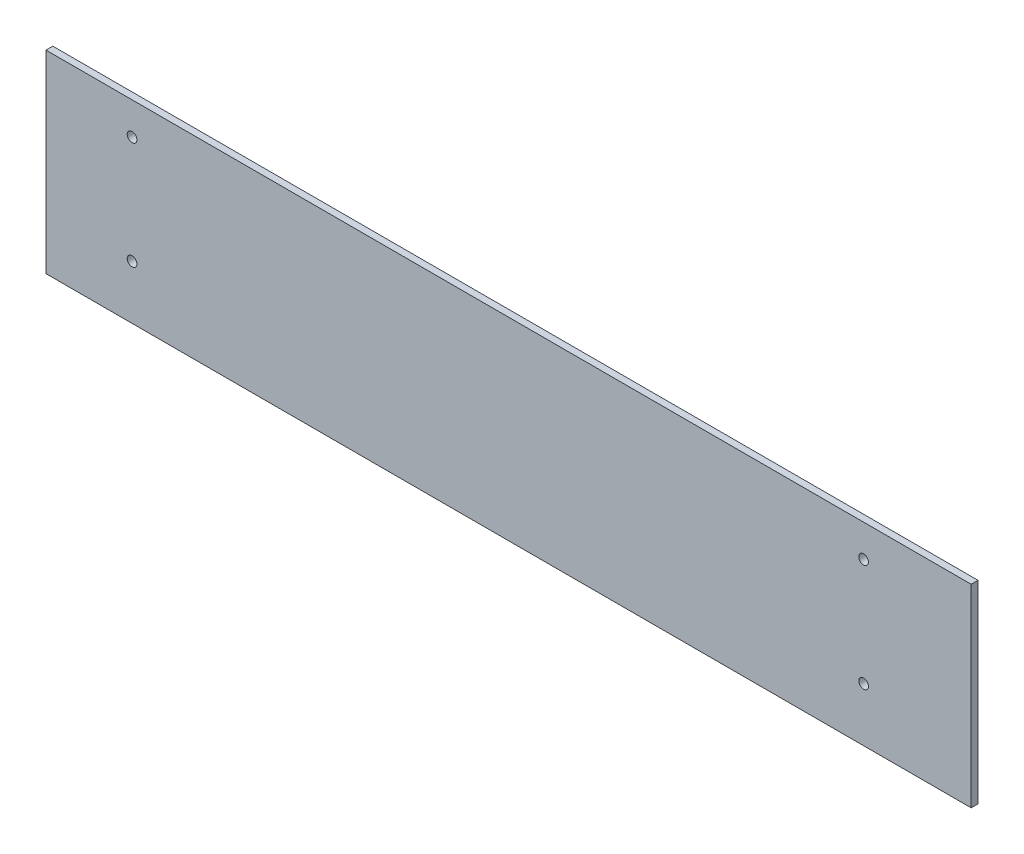
ISO-10303-21;
HEADER;
FILE_DESCRIPTION(('STEP AP214'),'2;1');
FILE_NAME('part.step','',(''),(''),'','','');
FILE_SCHEMA(('AUTOMOTIVE_DESIGN { 1 0 10303 214 1 1 1 1 }'));
ENDSEC;
DATA;
#1=APPLICATION_CONTEXT('core data for automotive mechanical design processes');
#2=APPLICATION_PROTOCOL_DEFINITION('international standard','automotive_design',2000,#1);
#3=PRODUCT_CONTEXT('',#1,'mechanical');
#4=PRODUCT('Part','Part','',(#3));
#5=PRODUCT_RELATED_PRODUCT_CATEGORY('part','',(#4));
#6=PRODUCT_DEFINITION_FORMATION('','',#4);
#7=PRODUCT_DEFINITION_CONTEXT('part definition',#1,'design');
#8=PRODUCT_DEFINITION('design','',#6,#7);
#9=PRODUCT_DEFINITION_SHAPE('','',#8);
#10=(LENGTH_UNIT() NAMED_UNIT(*) SI_UNIT(.MILLI.,.METRE.));
#11=(NAMED_UNIT(*) PLANE_ANGLE_UNIT() SI_UNIT($,.RADIAN.));
#12=(NAMED_UNIT(*) SI_UNIT($,.STERADIAN.) SOLID_ANGLE_UNIT());
#13=UNCERTAINTY_MEASURE_WITH_UNIT(LENGTH_MEASURE(1.E-05),#10,'distance_accuracy_value','');
#14=(GEOMETRIC_REPRESENTATION_CONTEXT(3) GLOBAL_UNCERTAINTY_ASSIGNED_CONTEXT((#13)) GLOBAL_UNIT_ASSIGNED_CONTEXT((#10,
#11,#12)) REPRESENTATION_CONTEXT('',''));
#15=CARTESIAN_POINT('',(0.,0.,0.));
#16=DIRECTION('',(0.,0.,1.));
#17=DIRECTION('',(1.,0.,0.));
#18=AXIS2_PLACEMENT_3D('',#15,#16,#17);
#19=CARTESIAN_POINT('',(215.,-45.,3.175));
#20=DIRECTION('',(-1.,0.,0.));
#21=DIRECTION('',(0.,0.,1.));
#22=AXIS2_PLACEMENT_3D('',#19,#20,#21);
#23=PLANE('',#22);
#24=DIRECTION('',(0.,1.,0.));
#25=VECTOR('',#24,1.);
#26=CARTESIAN_POINT('',(215.,-45.,0.));
#27=LINE('',#26,#25);
#28=CARTESIAN_POINT('',(215.,-45.,0.));
#29=VERTEX_POINT('',#28);
#30=CARTESIAN_POINT('',(215.,45.,0.));
#31=VERTEX_POINT('',#30);
#32=EDGE_CURVE('E111',#29,#31,#27,.T.);
#33=ORIENTED_EDGE('',*,*,#32,.T.);
#34=DIRECTION('',(0.,0.,-1.));
#35=VECTOR('',#34,1.);
#36=CARTESIAN_POINT('',(215.,45.,3.175));
#37=LINE('',#36,#35);
#38=CARTESIAN_POINT('',(215.,45.,3.175));
#39=VERTEX_POINT('',#38);
#40=EDGE_CURVE('E11',#39,#31,#37,.T.);
#41=ORIENTED_EDGE('',*,*,#40,.F.);
#42=DIRECTION('',(0.,1.,0.));
#43=VECTOR('',#42,1.);
#44=CARTESIAN_POINT('',(215.,-45.,3.175));
#45=LINE('',#44,#43);
#46=CARTESIAN_POINT('',(215.,-45.,3.175));
#47=VERTEX_POINT('',#46);
#48=EDGE_CURVE('E94',#47,#39,#45,.T.);
#49=ORIENTED_EDGE('',*,*,#48,.F.);
#50=DIRECTION('',(0.,0.,-1.));
#51=VECTOR('',#50,1.);
#52=CARTESIAN_POINT('',(215.,-45.,3.175));
#53=LINE('',#52,#51);
#54=EDGE_CURVE('E107',#47,#29,#53,.T.);
#55=ORIENTED_EDGE('',*,*,#54,.T.);
#56=EDGE_LOOP('',(#33,#41,#49,#55));
#57=FACE_BOUND('',#56,.T.);
#58=ADVANCED_FACE('F41',(#57),#23,.F.);
#59=CARTESIAN_POINT('',(-215.,45.,3.175));
#60=DIRECTION('',(0.,-1.,0.));
#61=DIRECTION('',(0.,0.,-1.));
#62=AXIS2_PLACEMENT_3D('',#59,#60,#61);
#63=PLANE('',#62);
#64=DIRECTION('',(-1.,0.,0.));
#65=VECTOR('',#64,1.);
#66=CARTESIAN_POINT('',(-215.,45.,0.));
#67=LINE('',#66,#65);
#68=CARTESIAN_POINT('',(-215.,45.,0.));
#69=VERTEX_POINT('',#68);
#70=EDGE_CURVE('E99',#31,#69,#67,.T.);
#71=ORIENTED_EDGE('',*,*,#70,.T.);
#72=DIRECTION('',(0.,0.,-1.));
#73=VECTOR('',#72,1.);
#74=CARTESIAN_POINT('',(-215.,45.,3.175));
#75=LINE('',#74,#73);
#76=CARTESIAN_POINT('',(-215.,45.,3.175));
#77=VERTEX_POINT('',#76);
#78=EDGE_CURVE('E51',#77,#69,#75,.T.);
#79=ORIENTED_EDGE('',*,*,#78,.F.);
#80=DIRECTION('',(-1.,0.,0.));
#81=VECTOR('',#80,1.);
#82=CARTESIAN_POINT('',(-215.,45.,3.175));
#83=LINE('',#82,#81);
#84=EDGE_CURVE('E89',#39,#77,#83,.T.);
#85=ORIENTED_EDGE('',*,*,#84,.F.);
#86=ORIENTED_EDGE('',*,*,#40,.T.);
#87=EDGE_LOOP('',(#71,#79,#85,#86));
#88=FACE_BOUND('',#87,.T.);
#89=ADVANCED_FACE('F98',(#88),#63,.F.);
#90=CARTESIAN_POINT('',(-215.,-45.,3.175));
#91=DIRECTION('',(1.,0.,0.));
#92=DIRECTION('',(0.,0.,-1.));
#93=AXIS2_PLACEMENT_3D('',#90,#91,#92);
#94=PLANE('',#93);
#95=DIRECTION('',(0.,-1.,0.));
#96=VECTOR('',#95,1.);
#97=CARTESIAN_POINT('',(-215.,-45.,0.));
#98=LINE('',#97,#96);
#99=CARTESIAN_POINT('',(-215.,-45.,0.));
#100=VERTEX_POINT('',#99);
#101=EDGE_CURVE('E76',#69,#100,#98,.T.);
#102=ORIENTED_EDGE('',*,*,#101,.T.);
#103=DIRECTION('',(0.,0.,-1.));
#104=VECTOR('',#103,1.);
#105=CARTESIAN_POINT('',(-215.,-45.,3.175));
#106=LINE('',#105,#104);
#107=CARTESIAN_POINT('',(-215.,-45.,3.175));
#108=VERTEX_POINT('',#107);
#109=EDGE_CURVE('E101',#108,#100,#106,.T.);
#110=ORIENTED_EDGE('',*,*,#109,.F.);
#111=DIRECTION('',(0.,-1.,0.));
#112=VECTOR('',#111,1.);
#113=CARTESIAN_POINT('',(-215.,-45.,3.175));
#114=LINE('',#113,#112);
#115=EDGE_CURVE('E92',#77,#108,#114,.T.);
#116=ORIENTED_EDGE('',*,*,#115,.F.);
#117=ORIENTED_EDGE('',*,*,#78,.T.);
#118=EDGE_LOOP('',(#102,#110,#116,#117));
#119=FACE_BOUND('',#118,.T.);
#120=ADVANCED_FACE('F103',(#119),#94,.F.);
#121=CARTESIAN_POINT('',(-215.,-45.,3.175));
#122=DIRECTION('',(0.,1.,0.));
#123=DIRECTION('',(0.,0.,1.));
#124=AXIS2_PLACEMENT_3D('',#121,#122,#123);
#125=PLANE('',#124);
#126=DIRECTION('',(1.,0.,0.));
#127=VECTOR('',#126,1.);
#128=CARTESIAN_POINT('',(-215.,-45.,0.));
#129=LINE('',#128,#127);
#130=EDGE_CURVE('E82',#100,#29,#129,.T.);
#131=ORIENTED_EDGE('',*,*,#130,.T.);
#132=ORIENTED_EDGE('',*,*,#54,.F.);
#133=DIRECTION('',(1.,0.,0.));
#134=VECTOR('',#133,1.);
#135=CARTESIAN_POINT('',(-215.,-45.,3.175));
#136=LINE('',#135,#134);
#137=EDGE_CURVE('E59',#108,#47,#136,.T.);
#138=ORIENTED_EDGE('',*,*,#137,.F.);
#139=ORIENTED_EDGE('',*,*,#109,.T.);
#140=EDGE_LOOP('',(#131,#132,#138,#139));
#141=FACE_BOUND('',#140,.T.);
#142=ADVANCED_FACE('F125',(#141),#125,.F.);
#143=CARTESIAN_POINT('',(0.,0.,3.175));
#144=DIRECTION('',(0.,0.,-1.));
#145=DIRECTION('',(-1.,0.,0.));
#146=AXIS2_PLACEMENT_3D('',#143,#144,#145);
#147=PLANE('',#146);
#148=CARTESIAN_POINT('',(165.,30.,3.175));
#149=DIRECTION('',(0.,0.,1.));
#150=DIRECTION('',(1.,0.,0.));
#151=AXIS2_PLACEMENT_3D('',#148,#149,#150);
#152=CIRCLE('',#151,2.25);
#153=CARTESIAN_POINT('',(167.25,30.,3.175));
#154=VERTEX_POINT('',#153);
#155=EDGE_CURVE('E155',#154,#154,#152,.T.);
#156=ORIENTED_EDGE('',*,*,#155,.F.);
#157=EDGE_LOOP('',(#156));
#158=FACE_BOUND('',#157,.T.);
#159=CARTESIAN_POINT('',(-175.,-20.,3.175));
#160=DIRECTION('',(0.,0.,1.));
#161=DIRECTION('',(1.,0.,0.));
#162=AXIS2_PLACEMENT_3D('',#159,#160,#161);
#163=CIRCLE('',#162,2.25);
#164=CARTESIAN_POINT('',(-172.75,-20.,3.175));
#165=VERTEX_POINT('',#164);
#166=EDGE_CURVE('E147',#165,#165,#163,.T.);
#167=ORIENTED_EDGE('',*,*,#166,.F.);
#168=EDGE_LOOP('',(#167));
#169=FACE_BOUND('',#168,.T.);
#170=CARTESIAN_POINT('',(-175.,30.,3.175));
#171=DIRECTION('',(0.,0.,1.));
#172=DIRECTION('',(1.,0.,0.));
#173=AXIS2_PLACEMENT_3D('',#170,#171,#172);
#174=CIRCLE('',#173,2.25);
#175=CARTESIAN_POINT('',(-172.75,30.,3.175));
#176=VERTEX_POINT('',#175);
#177=EDGE_CURVE('E143',#176,#176,#174,.T.);
#178=ORIENTED_EDGE('',*,*,#177,.F.);
#179=EDGE_LOOP('',(#178));
#180=FACE_BOUND('',#179,.T.);
#181=CARTESIAN_POINT('',(165.,-20.,3.175));
#182=DIRECTION('',(0.,0.,1.));
#183=DIRECTION('',(1.,0.,0.));
#184=AXIS2_PLACEMENT_3D('',#181,#182,#183);
#185=CIRCLE('',#184,2.25);
#186=CARTESIAN_POINT('',(167.25,-20.,3.175));
#187=VERTEX_POINT('',#186);
#188=EDGE_CURVE('E135',#187,#187,#185,.T.);
#189=ORIENTED_EDGE('',*,*,#188,.F.);
#190=EDGE_LOOP('',(#189));
#191=FACE_BOUND('',#190,.T.);
#192=ORIENTED_EDGE('',*,*,#48,.T.);
#193=ORIENTED_EDGE('',*,*,#84,.T.);
#194=ORIENTED_EDGE('',*,*,#115,.T.);
#195=ORIENTED_EDGE('',*,*,#137,.T.);
#196=EDGE_LOOP('',(#192,#193,#194,#195));
#197=FACE_BOUND('',#196,.T.);
#198=ADVANCED_FACE('F90',(#158,#169,#180,#191,#197),#147,.F.);
#199=CARTESIAN_POINT('',(0.,0.,0.));
#200=DIRECTION('',(0.,0.,-1.));
#201=DIRECTION('',(-1.,0.,0.));
#202=AXIS2_PLACEMENT_3D('',#199,#200,#201);
#203=PLANE('',#202);
#204=CARTESIAN_POINT('',(165.,30.,0.));
#205=DIRECTION('',(0.,0.,-1.));
#206=DIRECTION('',(-1.,0.,0.));
#207=AXIS2_PLACEMENT_3D('',#204,#205,#206);
#208=CIRCLE('',#207,2.25);
#209=CARTESIAN_POINT('',(162.75,30.,0.));
#210=VERTEX_POINT('',#209);
#211=EDGE_CURVE('E151',#210,#210,#208,.T.);
#212=ORIENTED_EDGE('',*,*,#211,.F.);
#213=EDGE_LOOP('',(#212));
#214=FACE_BOUND('',#213,.T.);
#215=CARTESIAN_POINT('',(-175.,-20.,0.));
#216=DIRECTION('',(0.,0.,-1.));
#217=DIRECTION('',(-1.,0.,0.));
#218=AXIS2_PLACEMENT_3D('',#215,#216,#217);
#219=CIRCLE('',#218,2.25);
#220=CARTESIAN_POINT('',(-177.25,-20.,0.));
#221=VERTEX_POINT('',#220);
#222=EDGE_CURVE('E44',#221,#221,#219,.T.);
#223=ORIENTED_EDGE('',*,*,#222,.F.);
#224=EDGE_LOOP('',(#223));
#225=FACE_BOUND('',#224,.T.);
#226=CARTESIAN_POINT('',(-175.,30.,0.));
#227=DIRECTION('',(0.,0.,-1.));
#228=DIRECTION('',(-1.,0.,0.));
#229=AXIS2_PLACEMENT_3D('',#226,#227,#228);
#230=CIRCLE('',#229,2.25);
#231=CARTESIAN_POINT('',(-177.25,30.,0.));
#232=VERTEX_POINT('',#231);
#233=EDGE_CURVE('E139',#232,#232,#230,.T.);
#234=ORIENTED_EDGE('',*,*,#233,.F.);
#235=EDGE_LOOP('',(#234));
#236=FACE_BOUND('',#235,.T.);
#237=CARTESIAN_POINT('',(165.,-20.,0.));
#238=DIRECTION('',(0.,0.,-1.));
#239=DIRECTION('',(-1.,0.,0.));
#240=AXIS2_PLACEMENT_3D('',#237,#238,#239);
#241=CIRCLE('',#240,2.25);
#242=CARTESIAN_POINT('',(162.75,-20.,0.));
#243=VERTEX_POINT('',#242);
#244=EDGE_CURVE('E115',#243,#243,#241,.T.);
#245=ORIENTED_EDGE('',*,*,#244,.F.);
#246=EDGE_LOOP('',(#245));
#247=FACE_BOUND('',#246,.T.);
#248=ORIENTED_EDGE('',*,*,#32,.F.);
#249=ORIENTED_EDGE('',*,*,#130,.F.);
#250=ORIENTED_EDGE('',*,*,#101,.F.);
#251=ORIENTED_EDGE('',*,*,#70,.F.);
#252=EDGE_LOOP('',(#248,#249,#250,#251));
#253=FACE_BOUND('',#252,.T.);
#254=ADVANCED_FACE('F128',(#214,#225,#236,#247,#253),#203,.T.);
#255=CARTESIAN_POINT('',(165.,-20.,3.175));
#256=DIRECTION('',(0.,0.,1.));
#257=DIRECTION('',(1.,0.,0.));
#258=AXIS2_PLACEMENT_3D('',#255,#256,#257);
#259=CYLINDRICAL_SURFACE('',#258,2.25);
#260=ORIENTED_EDGE('',*,*,#244,.T.);
#261=EDGE_LOOP('',(#260));
#262=FACE_BOUND('',#261,.T.);
#263=ORIENTED_EDGE('',*,*,#188,.T.);
#264=EDGE_LOOP('',(#263));
#265=FACE_BOUND('',#264,.T.);
#266=ADVANCED_FACE('F171',(#262,#265),#259,.F.);
#267=CARTESIAN_POINT('',(-175.,30.,3.175));
#268=DIRECTION('',(0.,0.,1.));
#269=DIRECTION('',(1.,0.,0.));
#270=AXIS2_PLACEMENT_3D('',#267,#268,#269);
#271=CYLINDRICAL_SURFACE('',#270,2.25);
#272=ORIENTED_EDGE('',*,*,#233,.T.);
#273=EDGE_LOOP('',(#272));
#274=FACE_BOUND('',#273,.T.);
#275=ORIENTED_EDGE('',*,*,#177,.T.);
#276=EDGE_LOOP('',(#275));
#277=FACE_BOUND('',#276,.T.);
#278=ADVANCED_FACE('F173',(#274,#277),#271,.F.);
#279=CARTESIAN_POINT('',(-175.,-20.,3.175));
#280=DIRECTION('',(0.,0.,1.));
#281=DIRECTION('',(1.,0.,0.));
#282=AXIS2_PLACEMENT_3D('',#279,#280,#281);
#283=CYLINDRICAL_SURFACE('',#282,2.25);
#284=ORIENTED_EDGE('',*,*,#222,.T.);
#285=EDGE_LOOP('',(#284));
#286=FACE_BOUND('',#285,.T.);
#287=ORIENTED_EDGE('',*,*,#166,.T.);
#288=EDGE_LOOP('',(#287));
#289=FACE_BOUND('',#288,.T.);
#290=ADVANCED_FACE('F180',(#286,#289),#283,.F.);
#291=CARTESIAN_POINT('',(165.,30.,3.175));
#292=DIRECTION('',(0.,0.,1.));
#293=DIRECTION('',(1.,0.,0.));
#294=AXIS2_PLACEMENT_3D('',#291,#292,#293);
#295=CYLINDRICAL_SURFACE('',#294,2.25);
#296=ORIENTED_EDGE('',*,*,#211,.T.);
#297=EDGE_LOOP('',(#296));
#298=FACE_BOUND('',#297,.T.);
#299=ORIENTED_EDGE('',*,*,#155,.T.);
#300=EDGE_LOOP('',(#299));
#301=FACE_BOUND('',#300,.T.);
#302=ADVANCED_FACE('F160',(#298,#301),#295,.F.);
#303=CLOSED_SHELL('',(#58,#89,#120,#142,#198,#254,#266,#278,#290,#302));
#304=MANIFOLD_SOLID_BREP('B2',#303);
#305=ADVANCED_BREP_SHAPE_REPRESENTATION('',(#18,#304),#14);
#306=SHAPE_DEFINITION_REPRESENTATION(#9,#305);
ENDSEC;
END-ISO-10303-21;
